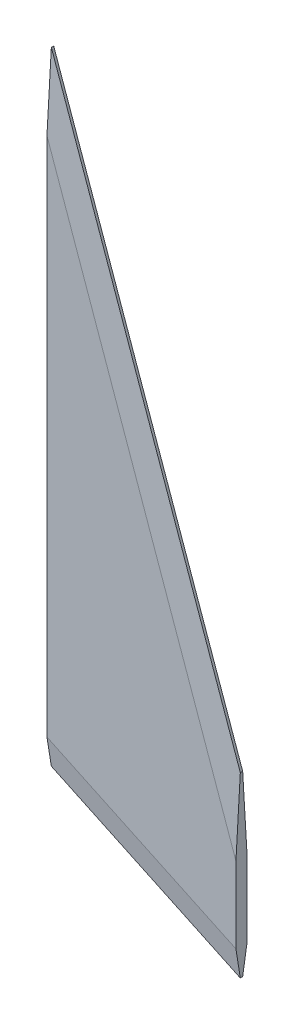
ISO-10303-21;
HEADER;
FILE_DESCRIPTION(('STEP AP214'),'2;1');
FILE_NAME('part.step','',(''),(''),'','','');
FILE_SCHEMA(('AUTOMOTIVE_DESIGN { 1 0 10303 214 1 1 1 1 }'));
ENDSEC;
DATA;
#1=APPLICATION_CONTEXT('core data for automotive mechanical design processes');
#2=APPLICATION_PROTOCOL_DEFINITION('international standard','automotive_design',2000,#1);
#3=PRODUCT_CONTEXT('',#1,'mechanical');
#4=PRODUCT('Part','Part','',(#3));
#5=PRODUCT_RELATED_PRODUCT_CATEGORY('part','',(#4));
#6=PRODUCT_DEFINITION_FORMATION('','',#4);
#7=PRODUCT_DEFINITION_CONTEXT('part definition',#1,'design');
#8=PRODUCT_DEFINITION('design','',#6,#7);
#9=PRODUCT_DEFINITION_SHAPE('','',#8);
#10=(LENGTH_UNIT() NAMED_UNIT(*) SI_UNIT(.MILLI.,.METRE.));
#11=(NAMED_UNIT(*) PLANE_ANGLE_UNIT() SI_UNIT($,.RADIAN.));
#12=(NAMED_UNIT(*) SI_UNIT($,.STERADIAN.) SOLID_ANGLE_UNIT());
#13=UNCERTAINTY_MEASURE_WITH_UNIT(LENGTH_MEASURE(1.E-05),#10,'distance_accuracy_value','');
#14=(GEOMETRIC_REPRESENTATION_CONTEXT(3) GLOBAL_UNCERTAINTY_ASSIGNED_CONTEXT((#13)) GLOBAL_UNIT_ASSIGNED_CONTEXT((#10,
#11,#12)) REPRESENTATION_CONTEXT('',''));
#15=CARTESIAN_POINT('',(0.,0.,0.));
#16=DIRECTION('',(0.,0.,1.));
#17=DIRECTION('',(1.,0.,0.));
#18=AXIS2_PLACEMENT_3D('',#15,#16,#17);
#19=CARTESIAN_POINT('',(37.564963769326,-86.0991773344031,1.5875));
#20=DIRECTION('',(0.425797036329881,0.904818702200993,0.));
#21=DIRECTION('',(-0.904818702200994,0.425797036329881,0.));
#22=AXIS2_PLACEMENT_3D('',#19,#20,#21);
#23=PLANE('',#22);
#24=DIRECTION('',(0.,0.,-1.));
#25=VECTOR('',#24,1.);
#26=CARTESIAN_POINT('',(-16.410036230674,-60.699177334403,1.5875));
#27=LINE('',#26,#25);
#28=CARTESIAN_POINT('',(-16.410036230674,-60.699177334403,0.337499999999999));
#29=VERTEX_POINT('',#28);
#30=CARTESIAN_POINT('',(-16.410036230674,-60.699177334403,-0.337499999999999));
#31=VERTEX_POINT('',#30);
#32=EDGE_CURVE('E173',#29,#31,#27,.T.);
#33=ORIENTED_EDGE('',*,*,#32,.T.);
#34=DIRECTION('',(0.904818702200994,-0.425797036329881,0.));
#35=VECTOR('',#34,1.);
#36=CARTESIAN_POINT('',(37.564963769326,-86.0991773344031,-0.337499999999999));
#37=LINE('',#36,#35);
#38=CARTESIAN_POINT('',(37.564963769326,-86.0991773344031,-0.337499999999999));
#39=VERTEX_POINT('',#38);
#40=EDGE_CURVE('E129',#31,#39,#37,.T.);
#41=ORIENTED_EDGE('',*,*,#40,.T.);
#42=DIRECTION('',(0.,0.,-1.));
#43=VECTOR('',#42,1.);
#44=CARTESIAN_POINT('',(37.564963769326,-86.0991773344031,1.5875));
#45=LINE('',#44,#43);
#46=CARTESIAN_POINT('',(37.564963769326,-86.0991773344031,0.337499999999999));
#47=VERTEX_POINT('',#46);
#48=EDGE_CURVE('E113',#47,#39,#45,.T.);
#49=ORIENTED_EDGE('',*,*,#48,.F.);
#50=DIRECTION('',(-0.904818702200994,0.425797036329881,0.));
#51=VECTOR('',#50,1.);
#52=CARTESIAN_POINT('',(37.564963769326,-86.0991773344031,0.337499999999999));
#53=LINE('',#52,#51);
#54=EDGE_CURVE('E126',#47,#29,#53,.T.);
#55=ORIENTED_EDGE('',*,*,#54,.T.);
#56=EDGE_LOOP('',(#33,#41,#49,#55));
#57=FACE_BOUND('',#56,.T.);
#58=ADVANCED_FACE('F43',(#57),#23,.F.);
#59=CARTESIAN_POINT('',(37.564963769326,-35.299177334403,1.5875));
#60=DIRECTION('',(-1.,0.,0.));
#61=DIRECTION('',(0.,-1.,0.));
#62=AXIS2_PLACEMENT_3D('',#59,#60,#61);
#63=PLANE('',#62);
#64=ORIENTED_EDGE('',*,*,#48,.T.);
#65=DIRECTION('',(0.,0.987510792384374,-0.157551372334187));
#66=VECTOR('',#65,1.);
#67=CARTESIAN_POINT('',(37.564963769326,-86.0991773344031,-0.337499999999999));
#68=LINE('',#67,#66);
#69=CARTESIAN_POINT('',(37.564963769326,-78.2643456081381,-1.5875));
#70=VERTEX_POINT('',#69);
#71=EDGE_CURVE('E120',#39,#70,#68,.T.);
#72=ORIENTED_EDGE('',*,*,#71,.T.);
#73=DIRECTION('',(0.,1.,0.));
#74=VECTOR('',#73,1.);
#75=CARTESIAN_POINT('',(37.564963769326,-35.299177334403,-1.5875));
#76=LINE('',#75,#74);
#77=CARTESIAN_POINT('',(37.564963769326,-56.53375261595,-1.5875));
#78=VERTEX_POINT('',#77);
#79=EDGE_CURVE('E179',#70,#78,#76,.T.);
#80=ORIENTED_EDGE('',*,*,#79,.T.);
#81=DIRECTION('',(0.,0.998271871783522,0.0587645301676359));
#82=VECTOR('',#81,1.);
#83=CARTESIAN_POINT('',(37.5649637693259,116.57454431671,8.6027377747986));
#84=LINE('',#83,#82);
#85=CARTESIAN_POINT('',(37.564963769326,-35.299177334403,-0.337499999999999));
#86=VERTEX_POINT('',#85);
#87=EDGE_CURVE('E121',#78,#86,#84,.T.);
#88=ORIENTED_EDGE('',*,*,#87,.T.);
#89=DIRECTION('',(0.,0.,-1.));
#90=VECTOR('',#89,1.);
#91=CARTESIAN_POINT('',(37.564963769326,-35.299177334403,1.5875));
#92=LINE('',#91,#90);
#93=CARTESIAN_POINT('',(37.564963769326,-35.299177334403,0.337499999999998));
#94=VERTEX_POINT('',#93);
#95=EDGE_CURVE('E130',#94,#86,#92,.T.);
#96=ORIENTED_EDGE('',*,*,#95,.F.);
#97=DIRECTION('',(0.,0.998271871783522,-0.0587645301676362));
#98=VECTOR('',#97,1.);
#99=CARTESIAN_POINT('',(37.564963769326,5.30624812374371,-2.05278947599398));
#100=LINE('',#99,#98);
#101=CARTESIAN_POINT('',(37.564963769326,-56.5337526159499,1.5875));
#102=VERTEX_POINT('',#101);
#103=EDGE_CURVE('E136',#94,#102,#100,.F.);
#104=ORIENTED_EDGE('',*,*,#103,.T.);
#105=DIRECTION('',(0.,1.,0.));
#106=VECTOR('',#105,1.);
#107=CARTESIAN_POINT('',(37.564963769326,-35.299177334403,1.5875));
#108=LINE('',#107,#106);
#109=CARTESIAN_POINT('',(37.564963769326,-78.2643456081381,1.5875));
#110=VERTEX_POINT('',#109);
#111=EDGE_CURVE('E115',#110,#102,#108,.T.);
#112=ORIENTED_EDGE('',*,*,#111,.F.);
#113=DIRECTION('',(0.,0.987510792384374,0.157551372334187));
#114=VECTOR('',#113,1.);
#115=CARTESIAN_POINT('',(37.564963769326,-50.3136206184186,6.0468690659653));
#116=LINE('',#115,#114);
#117=EDGE_CURVE('E110',#110,#47,#116,.F.);
#118=ORIENTED_EDGE('',*,*,#117,.T.);
#119=EDGE_LOOP('',(#64,#72,#80,#88,#96,#104,#112,#118));
#120=FACE_BOUND('',#119,.T.);
#121=ADVANCED_FACE('F112',(#120),#63,.F.);
#122=CARTESIAN_POINT('',(-16.410036230674,117.100822665597,1.5875));
#123=DIRECTION('',(-0.942627225161207,-0.333847142244594,0.));
#124=DIRECTION('',(0.333847142244594,-0.942627225161208,0.));
#125=AXIS2_PLACEMENT_3D('',#122,#123,#124);
#126=PLANE('',#125);
#127=ORIENTED_EDGE('',*,*,#95,.T.);
#128=DIRECTION('',(-0.333847142244594,0.942627225161208,0.));
#129=VECTOR('',#128,1.);
#130=CARTESIAN_POINT('',(-16.410036230674,117.100822665597,-0.337499999999999));
#131=LINE('',#130,#129);
#132=CARTESIAN_POINT('',(-16.410036230674,117.100822665597,-0.337499999999999));
#133=VERTEX_POINT('',#132);
#134=EDGE_CURVE('E11',#86,#133,#131,.T.);
#135=ORIENTED_EDGE('',*,*,#134,.T.);
#136=DIRECTION('',(0.,0.,-1.));
#137=VECTOR('',#136,1.);
#138=CARTESIAN_POINT('',(-16.410036230674,117.100822665597,1.5875));
#139=LINE('',#138,#137);
#140=CARTESIAN_POINT('',(-16.410036230674,117.100822665597,0.337499999999998));
#141=VERTEX_POINT('',#140);
#142=EDGE_CURVE('E161',#141,#133,#139,.T.);
#143=ORIENTED_EDGE('',*,*,#142,.F.);
#144=DIRECTION('',(0.333847142244594,-0.942627225161208,0.));
#145=VECTOR('',#144,1.);
#146=CARTESIAN_POINT('',(-16.410036230674,117.100822665597,0.337499999999998));
#147=LINE('',#146,#145);
#148=EDGE_CURVE('E52',#141,#94,#147,.T.);
#149=ORIENTED_EDGE('',*,*,#148,.T.);
#150=EDGE_LOOP('',(#127,#135,#143,#149));
#151=FACE_BOUND('',#150,.T.);
#152=ADVANCED_FACE('F160',(#151),#126,.F.);
#153=CARTESIAN_POINT('',(-16.410036230674,-60.699177334403,1.5875));
#154=DIRECTION('',(1.,0.,0.));
#155=DIRECTION('',(0.,1.,0.));
#156=AXIS2_PLACEMENT_3D('',#153,#154,#155);
#157=PLANE('',#156);
#158=DIRECTION('',(0.,-1.,0.));
#159=VECTOR('',#158,1.);
#160=CARTESIAN_POINT('',(-16.410036230674,-60.699177334403,-1.5875));
#161=LINE('',#160,#159);
#162=CARTESIAN_POINT('',(-16.410036230674,95.86624738405,-1.5875));
#163=VERTEX_POINT('',#162);
#164=CARTESIAN_POINT('',(-16.410036230674,-52.864345608138,-1.5875));
#165=VERTEX_POINT('',#164);
#166=EDGE_CURVE('E176',#163,#165,#161,.T.);
#167=ORIENTED_EDGE('',*,*,#166,.T.);
#168=DIRECTION('',(0.,-0.987510792384374,0.157551372334187));
#169=VECTOR('',#168,1.);
#170=CARTESIAN_POINT('',(-16.410036230674,-85.4686874873237,3.61432548558847));
#171=LINE('',#170,#169);
#172=EDGE_CURVE('E150',#165,#31,#171,.T.);
#173=ORIENTED_EDGE('',*,*,#172,.T.);
#174=ORIENTED_EDGE('',*,*,#32,.F.);
#175=DIRECTION('',(0.,-0.987510792384374,-0.157551372334187));
#176=VECTOR('',#175,1.);
#177=CARTESIAN_POINT('',(-16.410036230674,-49.6831307713392,2.09504358037684));
#178=LINE('',#177,#176);
#179=CARTESIAN_POINT('',(-16.410036230674,-52.864345608138,1.5875));
#180=VERTEX_POINT('',#179);
#181=EDGE_CURVE('E134',#29,#180,#178,.F.);
#182=ORIENTED_EDGE('',*,*,#181,.T.);
#183=DIRECTION('',(0.,-1.,0.));
#184=VECTOR('',#183,1.);
#185=CARTESIAN_POINT('',(-16.410036230674,-60.699177334403,1.5875));
#186=LINE('',#185,#184);
#187=CARTESIAN_POINT('',(-16.410036230674,95.8662473840501,1.5875));
#188=VERTEX_POINT('',#187);
#189=EDGE_CURVE('E170',#188,#180,#186,.T.);
#190=ORIENTED_EDGE('',*,*,#189,.F.);
#191=DIRECTION('',(0.,-0.998271871783522,0.0587645301676362));
#192=VECTOR('',#191,1.);
#193=CARTESIAN_POINT('',(-16.410036230674,5.83252647263113,6.88744829880466));
#194=LINE('',#193,#192);
#195=EDGE_CURVE('E66',#188,#141,#194,.F.);
#196=ORIENTED_EDGE('',*,*,#195,.T.);
#197=ORIENTED_EDGE('',*,*,#142,.T.);
#198=DIRECTION('',(0.,-0.998271871783522,-0.058764530167636));
#199=VECTOR('',#198,1.);
#200=CARTESIAN_POINT('',(-16.410036230674,117.100822665597,-0.337499999999999));
#201=LINE('',#200,#199);
#202=EDGE_CURVE('E59',#133,#163,#201,.T.);
#203=ORIENTED_EDGE('',*,*,#202,.T.);
#204=EDGE_LOOP('',(#167,#173,#174,#182,#190,#196,#197,#203));
#205=FACE_BOUND('',#204,.T.);
#206=ADVANCED_FACE('F172',(#205),#157,.F.);
#207=CARTESIAN_POINT('',(0.,0.,1.5875));
#208=DIRECTION('',(0.,0.,-1.));
#209=DIRECTION('',(-1.,0.,0.));
#210=AXIS2_PLACEMENT_3D('',#207,#208,#209);
#211=PLANE('',#210);
#212=ORIENTED_EDGE('',*,*,#189,.T.);
#213=DIRECTION('',(0.904818702200993,-0.425797036329881,0.));
#214=VECTOR('',#213,1.);
#215=CARTESIAN_POINT('',(-23.3421907123794,-49.6021552638061,1.5875));
#216=LINE('',#215,#214);
#217=EDGE_CURVE('E155',#180,#110,#216,.T.);
#218=ORIENTED_EDGE('',*,*,#217,.T.);
#219=ORIENTED_EDGE('',*,*,#111,.T.);
#220=DIRECTION('',(-0.333847142244594,0.942627225161207,0.));
#221=VECTOR('',#220,1.);
#222=CARTESIAN_POINT('',(15.5874023871623,5.52053834545333,1.5875));
#223=LINE('',#222,#221);
#224=EDGE_CURVE('E152',#102,#188,#223,.T.);
#225=ORIENTED_EDGE('',*,*,#224,.T.);
#226=EDGE_LOOP('',(#212,#218,#219,#225));
#227=FACE_BOUND('',#226,.T.);
#228=ADVANCED_FACE('F169',(#227),#211,.F.);
#229=CARTESIAN_POINT('',(0.,0.,-1.5875));
#230=DIRECTION('',(0.,0.,-1.));
#231=DIRECTION('',(-1.,0.,0.));
#232=AXIS2_PLACEMENT_3D('',#229,#230,#231);
#233=PLANE('',#232);
#234=ORIENTED_EDGE('',*,*,#79,.F.);
#235=DIRECTION('',(-0.904818702200993,0.425797036329881,0.));
#236=VECTOR('',#235,1.);
#237=CARTESIAN_POINT('',(-13.391517491943,-54.2848250145997,-1.5875));
#238=LINE('',#237,#236);
#239=EDGE_CURVE('E145',#70,#165,#238,.T.);
#240=ORIENTED_EDGE('',*,*,#239,.T.);
#241=ORIENTED_EDGE('',*,*,#166,.F.);
#242=DIRECTION('',(0.333847142244594,-0.942627225161207,0.));
#243=VECTOR('',#242,1.);
#244=CARTESIAN_POINT('',(30.8825829634092,-37.6658538698319,-1.5875));
#245=LINE('',#244,#243);
#246=EDGE_CURVE('E143',#163,#78,#245,.T.);
#247=ORIENTED_EDGE('',*,*,#246,.T.);
#248=EDGE_LOOP('',(#234,#240,#241,#247));
#249=FACE_BOUND('',#248,.T.);
#250=ADVANCED_FACE('F186',(#249),#233,.T.);
#251=CARTESIAN_POINT('',(37.564963769326,-86.0991773344031,-0.337499999999999));
#252=DIRECTION('',(-0.0739388794146627,-0.157120118756158,-0.984807753012208));
#253=DIRECTION('',(-0.904818702200994,0.425797036329881,0.));
#254=AXIS2_PLACEMENT_3D('',#251,#252,#253);
#255=PLANE('',#254);
#256=ORIENTED_EDGE('',*,*,#172,.F.);
#257=ORIENTED_EDGE('',*,*,#239,.F.);
#258=ORIENTED_EDGE('',*,*,#71,.F.);
#259=ORIENTED_EDGE('',*,*,#40,.F.);
#260=EDGE_LOOP('',(#256,#257,#258,#259));
#261=FACE_BOUND('',#260,.T.);
#262=ADVANCED_FACE('F196',(#261),#255,.T.);
#263=CARTESIAN_POINT('',(-23.3421907123794,-49.6021552638061,1.5875));
#264=DIRECTION('',(0.0739388794146627,0.157120118756158,-0.984807753012208));
#265=DIRECTION('',(0.904818702200994,-0.425797036329881,0.));
#266=AXIS2_PLACEMENT_3D('',#263,#264,#265);
#267=PLANE('',#266);
#268=ORIENTED_EDGE('',*,*,#181,.F.);
#269=ORIENTED_EDGE('',*,*,#54,.F.);
#270=ORIENTED_EDGE('',*,*,#117,.F.);
#271=ORIENTED_EDGE('',*,*,#217,.F.);
#272=EDGE_LOOP('',(#268,#269,#270,#271));
#273=FACE_BOUND('',#272,.T.);
#274=ADVANCED_FACE('F133',(#273),#267,.F.);
#275=CARTESIAN_POINT('',(-16.410036230674,117.100822665597,-0.337499999999999));
#276=DIRECTION('',(0.163685499868479,0.0579719478700862,-0.984807753012208));
#277=DIRECTION('',(0.333847142244594,-0.942627225161208,0.));
#278=AXIS2_PLACEMENT_3D('',#275,#276,#277);
#279=PLANE('',#278);
#280=ORIENTED_EDGE('',*,*,#87,.F.);
#281=ORIENTED_EDGE('',*,*,#246,.F.);
#282=ORIENTED_EDGE('',*,*,#202,.F.);
#283=ORIENTED_EDGE('',*,*,#134,.F.);
#284=EDGE_LOOP('',(#280,#281,#282,#283));
#285=FACE_BOUND('',#284,.T.);
#286=ADVANCED_FACE('F188',(#285),#279,.T.);
#287=CARTESIAN_POINT('',(15.5874023871623,5.52053834545333,1.5875));
#288=DIRECTION('',(-0.163685499868479,-0.0579719478700865,-0.984807753012208));
#289=DIRECTION('',(-0.333847142244594,0.942627225161208,0.));
#290=AXIS2_PLACEMENT_3D('',#287,#288,#289);
#291=PLANE('',#290);
#292=ORIENTED_EDGE('',*,*,#103,.F.);
#293=ORIENTED_EDGE('',*,*,#148,.F.);
#294=ORIENTED_EDGE('',*,*,#195,.F.);
#295=ORIENTED_EDGE('',*,*,#224,.F.);
#296=EDGE_LOOP('',(#292,#293,#294,#295));
#297=FACE_BOUND('',#296,.T.);
#298=ADVANCED_FACE('F46',(#297),#291,.F.);
#299=CLOSED_SHELL('',(#58,#121,#152,#206,#228,#250,#262,#274,#286,#298));
#300=MANIFOLD_SOLID_BREP('B2',#299);
#301=ADVANCED_BREP_SHAPE_REPRESENTATION('',(#18,#300),#14);
#302=SHAPE_DEFINITION_REPRESENTATION(#9,#301);
ENDSEC;
END-ISO-10303-21;
